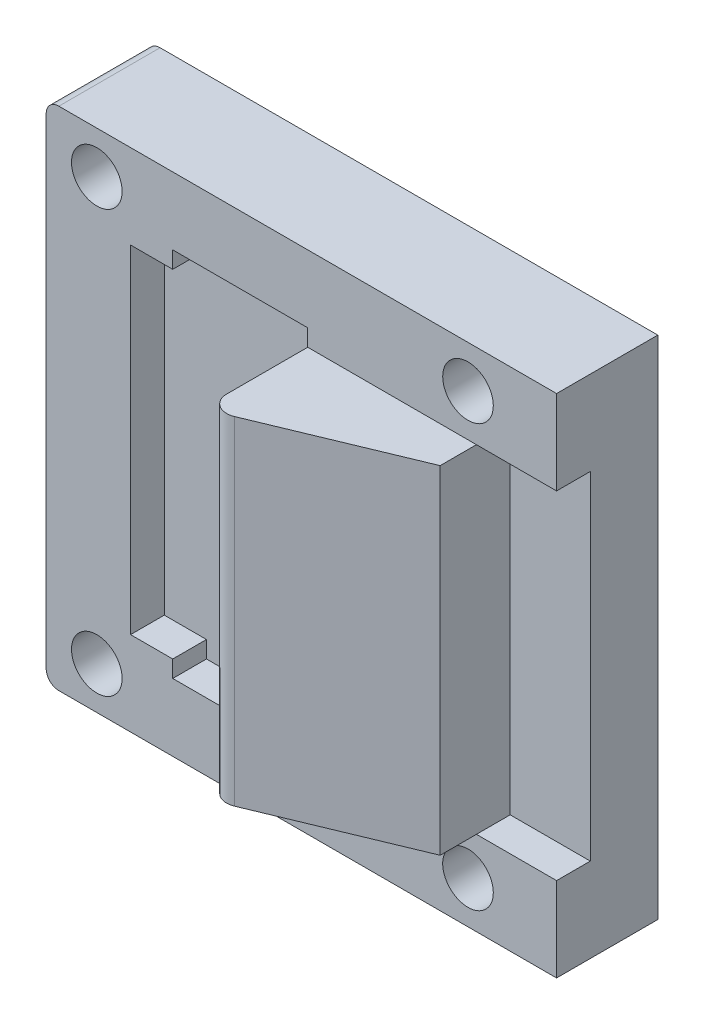
ISO-10303-21;
HEADER;
FILE_DESCRIPTION(('STEP AP214'),'2;1');
FILE_NAME('part.step','',(''),(''),'','','');
FILE_SCHEMA(('AUTOMOTIVE_DESIGN { 1 0 10303 214 1 1 1 1 }'));
ENDSEC;
DATA;
#1=APPLICATION_CONTEXT('core data for automotive mechanical design processes');
#2=APPLICATION_PROTOCOL_DEFINITION('international standard','automotive_design',2000,#1);
#3=PRODUCT_CONTEXT('',#1,'mechanical');
#4=PRODUCT('Part','Part','',(#3));
#5=PRODUCT_RELATED_PRODUCT_CATEGORY('part','',(#4));
#6=PRODUCT_DEFINITION_FORMATION('','',#4);
#7=PRODUCT_DEFINITION_CONTEXT('part definition',#1,'design');
#8=PRODUCT_DEFINITION('design','',#6,#7);
#9=PRODUCT_DEFINITION_SHAPE('','',#8);
#10=(LENGTH_UNIT() NAMED_UNIT(*) SI_UNIT(.MILLI.,.METRE.));
#11=(NAMED_UNIT(*) PLANE_ANGLE_UNIT() SI_UNIT($,.RADIAN.));
#12=(NAMED_UNIT(*) SI_UNIT($,.STERADIAN.) SOLID_ANGLE_UNIT());
#13=UNCERTAINTY_MEASURE_WITH_UNIT(LENGTH_MEASURE(1.E-05),#10,'distance_accuracy_value','');
#14=(GEOMETRIC_REPRESENTATION_CONTEXT(3) GLOBAL_UNCERTAINTY_ASSIGNED_CONTEXT((#13)) GLOBAL_UNIT_ASSIGNED_CONTEXT((#10,
#11,#12)) REPRESENTATION_CONTEXT('',''));
#15=CARTESIAN_POINT('',(0.,0.,0.));
#16=DIRECTION('',(0.,0.,1.));
#17=DIRECTION('',(1.,0.,0.));
#18=AXIS2_PLACEMENT_3D('',#15,#16,#17);
#19=CARTESIAN_POINT('',(-19.25,-14.25,6.));
#20=DIRECTION('',(0.,0.,1.));
#21=DIRECTION('',(0.,-1.,0.));
#22=AXIS2_PLACEMENT_3D('',#19,#20,#21);
#23=CYLINDRICAL_SURFACE('',#22,0.75);
#24=DIRECTION('',(0.,0.,1.));
#25=VECTOR('',#24,1.);
#26=CARTESIAN_POINT('',(-20.,-14.25,6.));
#27=LINE('',#26,#25);
#28=CARTESIAN_POINT('',(-20.,-14.25,0.));
#29=VERTEX_POINT('',#28);
#30=CARTESIAN_POINT('',(-20.,-14.25,6.));
#31=VERTEX_POINT('',#30);
#32=EDGE_CURVE('E266',#29,#31,#27,.T.);
#33=ORIENTED_EDGE('',*,*,#32,.F.);
#34=CARTESIAN_POINT('',(-19.25,-14.25,0.));
#35=DIRECTION('',(0.,0.,1.));
#36=DIRECTION('',(1.,0.,0.));
#37=AXIS2_PLACEMENT_3D('',#34,#35,#36);
#38=CIRCLE('',#37,0.75);
#39=CARTESIAN_POINT('',(-19.25,-15.,0.));
#40=VERTEX_POINT('',#39);
#41=EDGE_CURVE('E272',#40,#29,#38,.F.);
#42=ORIENTED_EDGE('',*,*,#41,.F.);
#43=DIRECTION('',(0.,0.,1.));
#44=VECTOR('',#43,1.);
#45=CARTESIAN_POINT('',(-19.25,-15.,6.));
#46=LINE('',#45,#44);
#47=CARTESIAN_POINT('',(-19.25,-15.,6.));
#48=VERTEX_POINT('',#47);
#49=EDGE_CURVE('E269',#48,#40,#46,.F.);
#50=ORIENTED_EDGE('',*,*,#49,.F.);
#51=CARTESIAN_POINT('',(-19.25,-14.25,6.));
#52=DIRECTION('',(0.,0.,-1.));
#53=DIRECTION('',(0.,1.,0.));
#54=AXIS2_PLACEMENT_3D('',#51,#52,#53);
#55=CIRCLE('',#54,0.75);
#56=EDGE_CURVE('E42',#31,#48,#55,.F.);
#57=ORIENTED_EDGE('',*,*,#56,.F.);
#58=EDGE_LOOP('',(#33,#42,#50,#57));
#59=FACE_BOUND('',#58,.T.);
#60=ADVANCED_FACE('F35',(#59),#23,.T.);
#61=CARTESIAN_POINT('',(-19.25,14.25,6.));
#62=DIRECTION('',(0.,0.,1.));
#63=DIRECTION('',(0.,-1.,0.));
#64=AXIS2_PLACEMENT_3D('',#61,#62,#63);
#65=CYLINDRICAL_SURFACE('',#64,0.75);
#66=DIRECTION('',(0.,0.,1.));
#67=VECTOR('',#66,1.);
#68=CARTESIAN_POINT('',(-19.25,15.,6.));
#69=LINE('',#68,#67);
#70=CARTESIAN_POINT('',(-19.25,15.,0.));
#71=VERTEX_POINT('',#70);
#72=CARTESIAN_POINT('',(-19.25,15.,6.));
#73=VERTEX_POINT('',#72);
#74=EDGE_CURVE('E257',#71,#73,#69,.T.);
#75=ORIENTED_EDGE('',*,*,#74,.F.);
#76=CARTESIAN_POINT('',(-19.25,14.25,0.));
#77=DIRECTION('',(0.,0.,1.));
#78=DIRECTION('',(1.,0.,0.));
#79=AXIS2_PLACEMENT_3D('',#76,#77,#78);
#80=CIRCLE('',#79,0.75);
#81=CARTESIAN_POINT('',(-20.,14.25,0.));
#82=VERTEX_POINT('',#81);
#83=EDGE_CURVE('E228',#82,#71,#80,.F.);
#84=ORIENTED_EDGE('',*,*,#83,.F.);
#85=DIRECTION('',(0.,0.,1.));
#86=VECTOR('',#85,1.);
#87=CARTESIAN_POINT('',(-20.,14.25,6.));
#88=LINE('',#87,#86);
#89=CARTESIAN_POINT('',(-20.,14.25,6.));
#90=VERTEX_POINT('',#89);
#91=EDGE_CURVE('E259',#90,#82,#88,.F.);
#92=ORIENTED_EDGE('',*,*,#91,.F.);
#93=CARTESIAN_POINT('',(-19.25,14.25,6.));
#94=DIRECTION('',(0.,0.,-1.));
#95=DIRECTION('',(0.,1.,0.));
#96=AXIS2_PLACEMENT_3D('',#93,#94,#95);
#97=CIRCLE('',#96,0.75);
#98=EDGE_CURVE('E263',#73,#90,#97,.F.);
#99=ORIENTED_EDGE('',*,*,#98,.F.);
#100=EDGE_LOOP('',(#75,#84,#92,#99));
#101=FACE_BOUND('',#100,.T.);
#102=ADVANCED_FACE('F430',(#101),#65,.T.);
#103=CARTESIAN_POINT('',(-3.5,-20.8269340073725,10.8023065992627));
#104=DIRECTION('',(0.,1.,0.));
#105=DIRECTION('',(0.,0.,1.));
#106=AXIS2_PLACEMENT_3D('',#103,#104,#105);
#107=CYLINDRICAL_SURFACE('',#106,1.);
#108=DIRECTION('',(0.,-1.,0.));
#109=VECTOR('',#108,1.);
#110=CARTESIAN_POINT('',(-3.11669665695071,-20.8269340073725,11.7259291126345));
#111=LINE('',#110,#109);
#112=CARTESIAN_POINT('',(-3.11669665695071,10.,11.7259291126345));
#113=VERTEX_POINT('',#112);
#114=CARTESIAN_POINT('',(-3.11669665695071,-10.,11.7259291126345));
#115=VERTEX_POINT('',#114);
#116=EDGE_CURVE('E243',#113,#115,#111,.T.);
#117=ORIENTED_EDGE('',*,*,#116,.F.);
#118=CARTESIAN_POINT('',(-3.5,10.,10.8023065992627));
#119=DIRECTION('',(0.,-1.,0.));
#120=DIRECTION('',(0.,0.,-1.));
#121=AXIS2_PLACEMENT_3D('',#118,#119,#120);
#122=CIRCLE('',#121,1.);
#123=CARTESIAN_POINT('',(-4.5,10.,10.8023065992627));
#124=VERTEX_POINT('',#123);
#125=EDGE_CURVE('E253',#124,#113,#122,.F.);
#126=ORIENTED_EDGE('',*,*,#125,.F.);
#127=DIRECTION('',(0.,-1.,0.));
#128=VECTOR('',#127,1.);
#129=CARTESIAN_POINT('',(-4.5,-20.8269340073725,10.8023065992627));
#130=LINE('',#129,#128);
#131=CARTESIAN_POINT('',(-4.5,-10.,10.8023065992627));
#132=VERTEX_POINT('',#131);
#133=EDGE_CURVE('E250',#132,#124,#130,.F.);
#134=ORIENTED_EDGE('',*,*,#133,.F.);
#135=CARTESIAN_POINT('',(-3.5,-10.,10.8023065992627));
#136=DIRECTION('',(0.,1.,0.));
#137=DIRECTION('',(-1.,0.,0.));
#138=AXIS2_PLACEMENT_3D('',#135,#136,#137);
#139=CIRCLE('',#138,1.);
#140=EDGE_CURVE('E255',#115,#132,#139,.F.);
#141=ORIENTED_EDGE('',*,*,#140,.F.);
#142=EDGE_LOOP('',(#117,#126,#134,#141));
#143=FACE_BOUND('',#142,.T.);
#144=ADVANCED_FACE('F463',(#143),#107,.T.);
#145=CARTESIAN_POINT('',(15.,-10.,6.));
#146=DIRECTION('',(0.,1.,0.));
#147=DIRECTION('',(-1.,0.,0.));
#148=AXIS2_PLACEMENT_3D('',#145,#146,#147);
#149=PLANE('',#148);
#150=DIRECTION('',(0.,0.,1.));
#151=VECTOR('',#150,1.);
#152=CARTESIAN_POINT('',(-12.5,-10.,6.));
#153=LINE('',#152,#151);
#154=CARTESIAN_POINT('',(-12.5,-10.,4.));
#155=VERTEX_POINT('',#154);
#156=CARTESIAN_POINT('',(-12.5,-10.,6.));
#157=VERTEX_POINT('',#156);
#158=EDGE_CURVE('E347',#155,#157,#153,.T.);
#159=ORIENTED_EDGE('',*,*,#158,.F.);
#160=DIRECTION('',(1.,0.,0.));
#161=VECTOR('',#160,1.);
#162=CARTESIAN_POINT('',(-15.,-10.,4.));
#163=LINE('',#162,#161);
#164=CARTESIAN_POINT('',(-15.,-10.,4.));
#165=VERTEX_POINT('',#164);
#166=EDGE_CURVE('E389',#165,#155,#163,.T.);
#167=ORIENTED_EDGE('',*,*,#166,.F.);
#168=DIRECTION('',(0.,0.,-1.));
#169=VECTOR('',#168,1.);
#170=CARTESIAN_POINT('',(-15.,-10.,6.));
#171=LINE('',#170,#169);
#172=CARTESIAN_POINT('',(-15.,-10.,6.));
#173=VERTEX_POINT('',#172);
#174=EDGE_CURVE('E240',#173,#165,#171,.T.);
#175=ORIENTED_EDGE('',*,*,#174,.F.);
#176=DIRECTION('',(1.,0.,0.));
#177=VECTOR('',#176,1.);
#178=CARTESIAN_POINT('',(15.,-10.,6.));
#179=LINE('',#178,#177);
#180=EDGE_CURVE('E247',#173,#157,#179,.T.);
#181=ORIENTED_EDGE('',*,*,#180,.T.);
#182=EDGE_LOOP('',(#159,#167,#175,#181));
#183=FACE_BOUND('',#182,.T.);
#184=ADVANCED_FACE('F482',(#183),#149,.T.);
#185=DIRECTION('',(0.,0.,1.));
#186=VECTOR('',#185,1.);
#187=CARTESIAN_POINT('',(10.25,-10.,6.));
#188=LINE('',#187,#186);
#189=CARTESIAN_POINT('',(10.25,-10.,4.));
#190=VERTEX_POINT('',#189);
#191=CARTESIAN_POINT('',(10.25,-10.,6.));
#192=VERTEX_POINT('',#191);
#193=EDGE_CURVE('E435',#190,#192,#188,.T.);
#194=ORIENTED_EDGE('',*,*,#193,.F.);
#195=DIRECTION('',(1.,0.,0.));
#196=VECTOR('',#195,1.);
#197=CARTESIAN_POINT('',(5.5,-10.,4.));
#198=LINE('',#197,#196);
#199=CARTESIAN_POINT('',(5.5,-10.,4.));
#200=VERTEX_POINT('',#199);
#201=EDGE_CURVE('E379',#200,#190,#198,.T.);
#202=ORIENTED_EDGE('',*,*,#201,.F.);
#203=DIRECTION('',(0.,0.,-1.));
#204=VECTOR('',#203,1.);
#205=CARTESIAN_POINT('',(5.5,-10.,32.6606797749979));
#206=LINE('',#205,#204);
#207=CARTESIAN_POINT('',(5.5,-10.,6.));
#208=VERTEX_POINT('',#207);
#209=EDGE_CURVE('E388',#208,#200,#206,.T.);
#210=ORIENTED_EDGE('',*,*,#209,.F.);
#211=EDGE_CURVE('E420',#208,#192,#179,.T.);
#212=ORIENTED_EDGE('',*,*,#211,.T.);
#213=EDGE_LOOP('',(#194,#202,#210,#212));
#214=FACE_BOUND('',#213,.T.);
#215=ADVANCED_FACE('F444',(#214),#149,.T.);
#216=CARTESIAN_POINT('',(15.,10.,6.));
#217=DIRECTION('',(0.,-1.,0.));
#218=DIRECTION('',(1.,0.,0.));
#219=AXIS2_PLACEMENT_3D('',#216,#217,#218);
#220=PLANE('',#219);
#221=DIRECTION('',(0.,0.,-1.));
#222=VECTOR('',#221,1.);
#223=CARTESIAN_POINT('',(-12.5,9.99999999999999,6.));
#224=LINE('',#223,#222);
#225=CARTESIAN_POINT('',(-12.5,9.99999999999999,6.));
#226=VERTEX_POINT('',#225);
#227=CARTESIAN_POINT('',(-12.5,10.,4.));
#228=VERTEX_POINT('',#227);
#229=EDGE_CURVE('E345',#226,#228,#224,.T.);
#230=ORIENTED_EDGE('',*,*,#229,.F.);
#231=DIRECTION('',(-1.,0.,0.));
#232=VECTOR('',#231,1.);
#233=CARTESIAN_POINT('',(15.,10.,6.));
#234=LINE('',#233,#232);
#235=CARTESIAN_POINT('',(-15.,9.99999999999999,6.));
#236=VERTEX_POINT('',#235);
#237=EDGE_CURVE('E413',#226,#236,#234,.T.);
#238=ORIENTED_EDGE('',*,*,#237,.T.);
#239=DIRECTION('',(0.,0.,-1.));
#240=VECTOR('',#239,1.);
#241=CARTESIAN_POINT('',(-15.,9.99999999999999,6.));
#242=LINE('',#241,#240);
#243=CARTESIAN_POINT('',(-15.,10.,4.));
#244=VERTEX_POINT('',#243);
#245=EDGE_CURVE('E244',#236,#244,#242,.T.);
#246=ORIENTED_EDGE('',*,*,#245,.T.);
#247=DIRECTION('',(-1.,0.,0.));
#248=VECTOR('',#247,1.);
#249=CARTESIAN_POINT('',(-15.,10.,4.));
#250=LINE('',#249,#248);
#251=EDGE_CURVE('E382',#228,#244,#250,.T.);
#252=ORIENTED_EDGE('',*,*,#251,.F.);
#253=EDGE_LOOP('',(#230,#238,#246,#252));
#254=FACE_BOUND('',#253,.T.);
#255=ADVANCED_FACE('F494',(#254),#220,.T.);
#256=DIRECTION('',(0.,0.,-1.));
#257=VECTOR('',#256,1.);
#258=CARTESIAN_POINT('',(10.25,10.,6.));
#259=LINE('',#258,#257);
#260=CARTESIAN_POINT('',(10.25,10.,6.));
#261=VERTEX_POINT('',#260);
#262=CARTESIAN_POINT('',(10.25,10.,4.));
#263=VERTEX_POINT('',#262);
#264=EDGE_CURVE('E48',#261,#263,#259,.T.);
#265=ORIENTED_EDGE('',*,*,#264,.F.);
#266=CARTESIAN_POINT('',(5.5,10.,6.));
#267=VERTEX_POINT('',#266);
#268=EDGE_CURVE('E414',#261,#267,#234,.T.);
#269=ORIENTED_EDGE('',*,*,#268,.T.);
#270=DIRECTION('',(0.,0.,-1.));
#271=VECTOR('',#270,1.);
#272=CARTESIAN_POINT('',(5.5,10.,32.6606797749979));
#273=LINE('',#272,#271);
#274=CARTESIAN_POINT('',(5.5,10.,4.));
#275=VERTEX_POINT('',#274);
#276=EDGE_CURVE('E408',#267,#275,#273,.T.);
#277=ORIENTED_EDGE('',*,*,#276,.T.);
#278=DIRECTION('',(-1.,0.,0.));
#279=VECTOR('',#278,1.);
#280=CARTESIAN_POINT('',(5.5,10.,4.));
#281=LINE('',#280,#279);
#282=EDGE_CURVE('E377',#263,#275,#281,.T.);
#283=ORIENTED_EDGE('',*,*,#282,.F.);
#284=EDGE_LOOP('',(#265,#269,#277,#283));
#285=FACE_BOUND('',#284,.T.);
#286=ADVANCED_FACE('F504',(#285),#220,.T.);
#287=CARTESIAN_POINT('',(0.,0.,0.));
#288=DIRECTION('',(0.,0.,1.));
#289=DIRECTION('',(1.,0.,0.));
#290=AXIS2_PLACEMENT_3D('',#287,#288,#289);
#291=PLANE('',#290);
#292=CARTESIAN_POINT('',(-17.,12.5,0.));
#293=DIRECTION('',(0.,0.,1.));
#294=DIRECTION('',(1.,0.,0.));
#295=AXIS2_PLACEMENT_3D('',#292,#293,#294);
#296=CIRCLE('',#295,1.5);
#297=CARTESIAN_POINT('',(-15.5,12.5,0.));
#298=VERTEX_POINT('',#297);
#299=EDGE_CURVE('E352',#298,#298,#296,.F.);
#300=ORIENTED_EDGE('',*,*,#299,.F.);
#301=EDGE_LOOP('',(#300));
#302=FACE_BOUND('',#301,.T.);
#303=CARTESIAN_POINT('',(5.,12.5,0.));
#304=DIRECTION('',(0.,0.,1.));
#305=DIRECTION('',(1.,0.,0.));
#306=AXIS2_PLACEMENT_3D('',#303,#304,#305);
#307=CIRCLE('',#306,1.5);
#308=CARTESIAN_POINT('',(6.5,12.5,0.));
#309=VERTEX_POINT('',#308);
#310=EDGE_CURVE('E358',#309,#309,#307,.F.);
#311=ORIENTED_EDGE('',*,*,#310,.F.);
#312=EDGE_LOOP('',(#311));
#313=FACE_BOUND('',#312,.T.);
#314=CARTESIAN_POINT('',(5.,-12.5,0.));
#315=DIRECTION('',(0.,0.,1.));
#316=DIRECTION('',(1.,0.,0.));
#317=AXIS2_PLACEMENT_3D('',#314,#315,#316);
#318=CIRCLE('',#317,1.5);
#319=CARTESIAN_POINT('',(6.5,-12.5,0.));
#320=VERTEX_POINT('',#319);
#321=EDGE_CURVE('E364',#320,#320,#318,.F.);
#322=ORIENTED_EDGE('',*,*,#321,.F.);
#323=EDGE_LOOP('',(#322));
#324=FACE_BOUND('',#323,.T.);
#325=CARTESIAN_POINT('',(-17.,-12.5,0.));
#326=DIRECTION('',(0.,0.,1.));
#327=DIRECTION('',(1.,0.,0.));
#328=AXIS2_PLACEMENT_3D('',#325,#326,#327);
#329=CIRCLE('',#328,1.5);
#330=CARTESIAN_POINT('',(-15.5,-12.5,0.));
#331=VERTEX_POINT('',#330);
#332=EDGE_CURVE('E370',#331,#331,#329,.F.);
#333=ORIENTED_EDGE('',*,*,#332,.F.);
#334=EDGE_LOOP('',(#333));
#335=FACE_BOUND('',#334,.T.);
#336=DIRECTION('',(1.,0.,0.));
#337=VECTOR('',#336,1.);
#338=CARTESIAN_POINT('',(15.,15.,0.));
#339=LINE('',#338,#337);
#340=CARTESIAN_POINT('',(10.25,15.,0.));
#341=VERTEX_POINT('',#340);
#342=EDGE_CURVE('E221',#71,#341,#339,.T.);
#343=ORIENTED_EDGE('',*,*,#342,.T.);
#344=DIRECTION('',(0.,-1.,0.));
#345=VECTOR('',#344,1.);
#346=CARTESIAN_POINT('',(10.25,17.7975936846337,0.));
#347=LINE('',#346,#345);
#348=CARTESIAN_POINT('',(10.25,-15.,0.));
#349=VERTEX_POINT('',#348);
#350=EDGE_CURVE('E205',#341,#349,#347,.T.);
#351=ORIENTED_EDGE('',*,*,#350,.T.);
#352=DIRECTION('',(-1.,0.,0.));
#353=VECTOR('',#352,1.);
#354=CARTESIAN_POINT('',(15.,-15.,0.));
#355=LINE('',#354,#353);
#356=EDGE_CURVE('E285',#349,#40,#355,.T.);
#357=ORIENTED_EDGE('',*,*,#356,.T.);
#358=ORIENTED_EDGE('',*,*,#41,.T.);
#359=DIRECTION('',(0.,1.,0.));
#360=VECTOR('',#359,1.);
#361=CARTESIAN_POINT('',(-20.,15.,0.));
#362=LINE('',#361,#360);
#363=CARTESIAN_POINT('',(-20.,-2.5,0.));
#364=VERTEX_POINT('',#363);
#365=EDGE_CURVE('E231',#29,#364,#362,.T.);
#366=ORIENTED_EDGE('',*,*,#365,.T.);
#367=DIRECTION('',(-1.,0.,0.));
#368=VECTOR('',#367,1.);
#369=CARTESIAN_POINT('',(7.49999999999999,-2.5,0.));
#370=LINE('',#369,#368);
#371=CARTESIAN_POINT('',(7.49999999999999,-2.5,0.));
#372=VERTEX_POINT('',#371);
#373=EDGE_CURVE('E304',#372,#364,#370,.T.);
#374=ORIENTED_EDGE('',*,*,#373,.F.);
#375=DIRECTION('',(0.,-1.,0.));
#376=VECTOR('',#375,1.);
#377=CARTESIAN_POINT('',(7.49999999999999,-2.5,0.));
#378=LINE('',#377,#376);
#379=CARTESIAN_POINT('',(7.5,2.5,0.));
#380=VERTEX_POINT('',#379);
#381=EDGE_CURVE('E224',#380,#372,#378,.T.);
#382=ORIENTED_EDGE('',*,*,#381,.F.);
#383=DIRECTION('',(1.,0.,0.));
#384=VECTOR('',#383,1.);
#385=CARTESIAN_POINT('',(7.5,2.5,0.));
#386=LINE('',#385,#384);
#387=CARTESIAN_POINT('',(-20.,2.5,0.));
#388=VERTEX_POINT('',#387);
#389=EDGE_CURVE('E294',#388,#380,#386,.T.);
#390=ORIENTED_EDGE('',*,*,#389,.F.);
#391=EDGE_CURVE('E236',#388,#82,#362,.T.);
#392=ORIENTED_EDGE('',*,*,#391,.T.);
#393=ORIENTED_EDGE('',*,*,#83,.T.);
#394=EDGE_LOOP('',(#343,#351,#357,#358,#366,#374,#382,#390,#392,#393));
#395=FACE_BOUND('',#394,.T.);
#396=ADVANCED_FACE('F226',(#302,#313,#324,#335,#395),#291,.F.);
#397=CARTESIAN_POINT('',(-15.,9.99999999999999,6.));
#398=DIRECTION('',(1.,0.,0.));
#399=DIRECTION('',(0.,0.,-1.));
#400=AXIS2_PLACEMENT_3D('',#397,#398,#399);
#401=PLANE('',#400);
#402=DIRECTION('',(0.,-1.,0.));
#403=VECTOR('',#402,1.);
#404=CARTESIAN_POINT('',(-15.,-10.,4.));
#405=LINE('',#404,#403);
#406=EDGE_CURVE('E392',#244,#165,#405,.T.);
#407=ORIENTED_EDGE('',*,*,#406,.F.);
#408=ORIENTED_EDGE('',*,*,#245,.F.);
#409=DIRECTION('',(0.,-1.,0.));
#410=VECTOR('',#409,1.);
#411=CARTESIAN_POINT('',(-15.,9.99999999999999,6.));
#412=LINE('',#411,#410);
#413=EDGE_CURVE('E416',#236,#173,#412,.T.);
#414=ORIENTED_EDGE('',*,*,#413,.T.);
#415=ORIENTED_EDGE('',*,*,#174,.T.);
#416=EDGE_LOOP('',(#407,#408,#414,#415));
#417=FACE_BOUND('',#416,.T.);
#418=ADVANCED_FACE('F490',(#417),#401,.T.);
#419=CARTESIAN_POINT('',(15.,15.,6.));
#420=DIRECTION('',(0.,1.,0.));
#421=DIRECTION('',(-1.,0.,0.));
#422=AXIS2_PLACEMENT_3D('',#419,#420,#421);
#423=PLANE('',#422);
#424=DIRECTION('',(0.,0.,1.));
#425=VECTOR('',#424,1.);
#426=CARTESIAN_POINT('',(10.25,15.,6.));
#427=LINE('',#426,#425);
#428=CARTESIAN_POINT('',(10.25,15.,6.));
#429=VERTEX_POINT('',#428);
#430=EDGE_CURVE('E208',#341,#429,#427,.T.);
#431=ORIENTED_EDGE('',*,*,#430,.F.);
#432=ORIENTED_EDGE('',*,*,#342,.F.);
#433=ORIENTED_EDGE('',*,*,#74,.T.);
#434=DIRECTION('',(1.,0.,0.));
#435=VECTOR('',#434,1.);
#436=CARTESIAN_POINT('',(15.,15.,6.));
#437=LINE('',#436,#435);
#438=EDGE_CURVE('E223',#73,#429,#437,.T.);
#439=ORIENTED_EDGE('',*,*,#438,.T.);
#440=EDGE_LOOP('',(#431,#432,#433,#439));
#441=FACE_BOUND('',#440,.T.);
#442=ADVANCED_FACE('F219',(#441),#423,.T.);
#443=CARTESIAN_POINT('',(-20.,15.,6.));
#444=DIRECTION('',(-1.,0.,0.));
#445=DIRECTION('',(0.,0.,1.));
#446=AXIS2_PLACEMENT_3D('',#443,#444,#445);
#447=PLANE('',#446);
#448=DIRECTION('',(0.,0.,-1.));
#449=VECTOR('',#448,1.);
#450=CARTESIAN_POINT('',(-20.,2.5,2.));
#451=LINE('',#450,#449);
#452=CARTESIAN_POINT('',(-20.,2.5,2.));
#453=VERTEX_POINT('',#452);
#454=EDGE_CURVE('E311',#453,#388,#451,.T.);
#455=ORIENTED_EDGE('',*,*,#454,.F.);
#456=DIRECTION('',(0.,1.,0.));
#457=VECTOR('',#456,1.);
#458=CARTESIAN_POINT('',(-20.,-2.5,2.));
#459=LINE('',#458,#457);
#460=CARTESIAN_POINT('',(-20.,-2.5,2.));
#461=VERTEX_POINT('',#460);
#462=EDGE_CURVE('E296',#461,#453,#459,.T.);
#463=ORIENTED_EDGE('',*,*,#462,.F.);
#464=DIRECTION('',(0.,0.,-1.));
#465=VECTOR('',#464,1.);
#466=CARTESIAN_POINT('',(-20.,-2.5,2.));
#467=LINE('',#466,#465);
#468=EDGE_CURVE('E313',#461,#364,#467,.T.);
#469=ORIENTED_EDGE('',*,*,#468,.T.);
#470=ORIENTED_EDGE('',*,*,#365,.F.);
#471=ORIENTED_EDGE('',*,*,#32,.T.);
#472=DIRECTION('',(0.,1.,0.));
#473=VECTOR('',#472,1.);
#474=CARTESIAN_POINT('',(-20.,15.,6.));
#475=LINE('',#474,#473);
#476=EDGE_CURVE('E233',#31,#90,#475,.T.);
#477=ORIENTED_EDGE('',*,*,#476,.T.);
#478=ORIENTED_EDGE('',*,*,#91,.T.);
#479=ORIENTED_EDGE('',*,*,#391,.F.);
#480=EDGE_LOOP('',(#455,#463,#469,#470,#471,#477,#478,#479));
#481=FACE_BOUND('',#480,.T.);
#482=ADVANCED_FACE('F431',(#481),#447,.T.);
#483=CARTESIAN_POINT('',(15.,-15.,6.));
#484=DIRECTION('',(0.,-1.,0.));
#485=DIRECTION('',(1.,0.,0.));
#486=AXIS2_PLACEMENT_3D('',#483,#484,#485);
#487=PLANE('',#486);
#488=DIRECTION('',(0.,0.,-1.));
#489=VECTOR('',#488,1.);
#490=CARTESIAN_POINT('',(10.25,-15.,6.));
#491=LINE('',#490,#489);
#492=CARTESIAN_POINT('',(10.25,-15.,6.));
#493=VERTEX_POINT('',#492);
#494=EDGE_CURVE('E211',#493,#349,#491,.T.);
#495=ORIENTED_EDGE('',*,*,#494,.F.);
#496=DIRECTION('',(-1.,0.,0.));
#497=VECTOR('',#496,1.);
#498=CARTESIAN_POINT('',(15.,-15.,6.));
#499=LINE('',#498,#497);
#500=EDGE_CURVE('E230',#493,#48,#499,.T.);
#501=ORIENTED_EDGE('',*,*,#500,.T.);
#502=ORIENTED_EDGE('',*,*,#49,.T.);
#503=ORIENTED_EDGE('',*,*,#356,.F.);
#504=EDGE_LOOP('',(#495,#501,#502,#503));
#505=FACE_BOUND('',#504,.T.);
#506=ADVANCED_FACE('F284',(#505),#487,.T.);
#507=CARTESIAN_POINT('',(0.,0.,6.));
#508=DIRECTION('',(0.,0.,-1.));
#509=DIRECTION('',(0.,1.,0.));
#510=AXIS2_PLACEMENT_3D('',#507,#508,#509);
#511=PLANE('',#510);
#512=CARTESIAN_POINT('',(-17.,12.5,6.));
#513=DIRECTION('',(0.,0.,1.));
#514=DIRECTION('',(-1.,0.,0.));
#515=AXIS2_PLACEMENT_3D('',#512,#513,#514);
#516=CIRCLE('',#515,1.5);
#517=CARTESIAN_POINT('',(-18.5,12.5,6.));
#518=VERTEX_POINT('',#517);
#519=EDGE_CURVE('E349',#518,#518,#516,.T.);
#520=ORIENTED_EDGE('',*,*,#519,.F.);
#521=EDGE_LOOP('',(#520));
#522=FACE_BOUND('',#521,.T.);
#523=CARTESIAN_POINT('',(5.,12.5,6.));
#524=DIRECTION('',(0.,0.,1.));
#525=DIRECTION('',(-1.,0.,0.));
#526=AXIS2_PLACEMENT_3D('',#523,#524,#525);
#527=CIRCLE('',#526,1.5);
#528=CARTESIAN_POINT('',(3.5,12.5,6.));
#529=VERTEX_POINT('',#528);
#530=EDGE_CURVE('E355',#529,#529,#527,.T.);
#531=ORIENTED_EDGE('',*,*,#530,.F.);
#532=EDGE_LOOP('',(#531));
#533=FACE_BOUND('',#532,.T.);
#534=CARTESIAN_POINT('',(5.,-12.5,6.));
#535=DIRECTION('',(0.,0.,1.));
#536=DIRECTION('',(1.,0.,0.));
#537=AXIS2_PLACEMENT_3D('',#534,#535,#536);
#538=CIRCLE('',#537,1.5);
#539=CARTESIAN_POINT('',(6.5,-12.5,6.));
#540=VERTEX_POINT('',#539);
#541=EDGE_CURVE('E361',#540,#540,#538,.T.);
#542=ORIENTED_EDGE('',*,*,#541,.F.);
#543=EDGE_LOOP('',(#542));
#544=FACE_BOUND('',#543,.T.);
#545=CARTESIAN_POINT('',(-17.,-12.5,6.));
#546=DIRECTION('',(0.,0.,1.));
#547=DIRECTION('',(1.,0.,0.));
#548=AXIS2_PLACEMENT_3D('',#545,#546,#547);
#549=CIRCLE('',#548,1.5);
#550=CARTESIAN_POINT('',(-15.5,-12.5,6.));
#551=VERTEX_POINT('',#550);
#552=EDGE_CURVE('E367',#551,#551,#549,.T.);
#553=ORIENTED_EDGE('',*,*,#552,.F.);
#554=EDGE_LOOP('',(#553));
#555=FACE_BOUND('',#554,.T.);
#556=ORIENTED_EDGE('',*,*,#500,.F.);
#557=DIRECTION('',(0.,1.,0.));
#558=VECTOR('',#557,1.);
#559=CARTESIAN_POINT('',(10.25,0.,6.));
#560=LINE('',#559,#558);
#561=EDGE_CURVE('E286',#493,#192,#560,.T.);
#562=ORIENTED_EDGE('',*,*,#561,.T.);
#563=ORIENTED_EDGE('',*,*,#211,.F.);
#564=CARTESIAN_POINT('',(-4.5,-10.,6.));
#565=VERTEX_POINT('',#564);
#566=EDGE_CURVE('E422',#565,#208,#179,.T.);
#567=ORIENTED_EDGE('',*,*,#566,.F.);
#568=DIRECTION('',(0.,1.,0.));
#569=VECTOR('',#568,1.);
#570=CARTESIAN_POINT('',(-4.5,11.,6.));
#571=LINE('',#570,#569);
#572=CARTESIAN_POINT('',(-4.5,-11.,6.));
#573=VERTEX_POINT('',#572);
#574=EDGE_CURVE('E331',#573,#565,#571,.T.);
#575=ORIENTED_EDGE('',*,*,#574,.F.);
#576=DIRECTION('',(1.,0.,0.));
#577=VECTOR('',#576,1.);
#578=CARTESIAN_POINT('',(-12.5,-11.,6.));
#579=LINE('',#578,#577);
#580=CARTESIAN_POINT('',(-12.5,-11.,6.));
#581=VERTEX_POINT('',#580);
#582=EDGE_CURVE('E327',#581,#573,#579,.T.);
#583=ORIENTED_EDGE('',*,*,#582,.F.);
#584=DIRECTION('',(0.,-1.,0.));
#585=VECTOR('',#584,1.);
#586=CARTESIAN_POINT('',(-12.5,11.,6.));
#587=LINE('',#586,#585);
#588=EDGE_CURVE('E310',#157,#581,#587,.T.);
#589=ORIENTED_EDGE('',*,*,#588,.F.);
#590=ORIENTED_EDGE('',*,*,#180,.F.);
#591=ORIENTED_EDGE('',*,*,#413,.F.);
#592=ORIENTED_EDGE('',*,*,#237,.F.);
#593=CARTESIAN_POINT('',(-12.5,11.,6.));
#594=VERTEX_POINT('',#593);
#595=EDGE_CURVE('E325',#594,#226,#587,.T.);
#596=ORIENTED_EDGE('',*,*,#595,.F.);
#597=DIRECTION('',(-1.,0.,0.));
#598=VECTOR('',#597,1.);
#599=CARTESIAN_POINT('',(-12.5,11.,6.));
#600=LINE('',#599,#598);
#601=CARTESIAN_POINT('',(-4.5,11.,6.));
#602=VERTEX_POINT('',#601);
#603=EDGE_CURVE('E333',#602,#594,#600,.T.);
#604=ORIENTED_EDGE('',*,*,#603,.F.);
#605=CARTESIAN_POINT('',(-4.5,10.,6.));
#606=VERTEX_POINT('',#605);
#607=EDGE_CURVE('E330',#606,#602,#571,.T.);
#608=ORIENTED_EDGE('',*,*,#607,.F.);
#609=EDGE_CURVE('E417',#267,#606,#234,.T.);
#610=ORIENTED_EDGE('',*,*,#609,.F.);
#611=ORIENTED_EDGE('',*,*,#268,.F.);
#612=EDGE_CURVE('E288',#261,#429,#560,.T.);
#613=ORIENTED_EDGE('',*,*,#612,.T.);
#614=ORIENTED_EDGE('',*,*,#438,.F.);
#615=ORIENTED_EDGE('',*,*,#98,.T.);
#616=ORIENTED_EDGE('',*,*,#476,.F.);
#617=ORIENTED_EDGE('',*,*,#56,.T.);
#618=EDGE_LOOP('',(#556,#562,#563,#567,#575,#583,#589,#590,#591,#592,#596,#604,#608,#610,#611,
#613,#614,#615,#616,#617));
#619=FACE_BOUND('',#618,.T.);
#620=ADVANCED_FACE('F278',(#522,#533,#544,#555,#619),#511,.F.);
#621=CARTESIAN_POINT('',(5.5,-10.,32.6606797749979));
#622=DIRECTION('',(0.,1.,0.));
#623=DIRECTION('',(-1.,0.,0.));
#624=AXIS2_PLACEMENT_3D('',#621,#622,#623);
#625=PLANE('',#624);
#626=DIRECTION('',(-0.923622513371796,0.,0.383303343049295));
#627=VECTOR('',#626,1.);
#628=CARTESIAN_POINT('',(-4.5,-10.,12.3));
#629=LINE('',#628,#627);
#630=CARTESIAN_POINT('',(5.5,-10.,8.15));
#631=VERTEX_POINT('',#630);
#632=EDGE_CURVE('E374',#631,#115,#629,.T.);
#633=ORIENTED_EDGE('',*,*,#632,.T.);
#634=ORIENTED_EDGE('',*,*,#140,.T.);
#635=DIRECTION('',(0.,0.,-1.));
#636=VECTOR('',#635,1.);
#637=CARTESIAN_POINT('',(-4.5,-10.,32.6606797749979));
#638=LINE('',#637,#636);
#639=EDGE_CURVE('E402',#132,#565,#638,.T.);
#640=ORIENTED_EDGE('',*,*,#639,.T.);
#641=ORIENTED_EDGE('',*,*,#566,.T.);
#642=EDGE_CURVE('E399',#631,#208,#206,.T.);
#643=ORIENTED_EDGE('',*,*,#642,.F.);
#644=EDGE_LOOP('',(#633,#634,#640,#641,#643));
#645=FACE_BOUND('',#644,.T.);
#646=ADVANCED_FACE('F448',(#645),#625,.F.);
#647=CARTESIAN_POINT('',(5.5,10.,32.6606797749979));
#648=DIRECTION('',(0.,-1.,0.));
#649=DIRECTION('',(0.,0.,-1.));
#650=AXIS2_PLACEMENT_3D('',#647,#648,#649);
#651=PLANE('',#650);
#652=DIRECTION('',(0.,0.,-1.));
#653=VECTOR('',#652,1.);
#654=CARTESIAN_POINT('',(-4.5,10.,32.6606797749979));
#655=LINE('',#654,#653);
#656=EDGE_CURVE('E405',#124,#606,#655,.T.);
#657=ORIENTED_EDGE('',*,*,#656,.F.);
#658=ORIENTED_EDGE('',*,*,#125,.T.);
#659=DIRECTION('',(0.923622513371796,0.,-0.383303343049295));
#660=VECTOR('',#659,1.);
#661=CARTESIAN_POINT('',(-4.5,10.,12.3));
#662=LINE('',#661,#660);
#663=CARTESIAN_POINT('',(5.5,10.,8.15));
#664=VERTEX_POINT('',#663);
#665=EDGE_CURVE('E373',#113,#664,#662,.T.);
#666=ORIENTED_EDGE('',*,*,#665,.T.);
#667=EDGE_CURVE('E398',#664,#267,#273,.T.);
#668=ORIENTED_EDGE('',*,*,#667,.T.);
#669=ORIENTED_EDGE('',*,*,#609,.T.);
#670=EDGE_LOOP('',(#657,#658,#666,#668,#669));
#671=FACE_BOUND('',#670,.T.);
#672=ADVANCED_FACE('F499',(#671),#651,.F.);
#673=CARTESIAN_POINT('',(-4.5,-10.,32.6606797749979));
#674=DIRECTION('',(1.,0.,0.));
#675=DIRECTION('',(0.,0.,-1.));
#676=AXIS2_PLACEMENT_3D('',#673,#674,#675);
#677=PLANE('',#676);
#678=ORIENTED_EDGE('',*,*,#656,.T.);
#679=ORIENTED_EDGE('',*,*,#607,.T.);
#680=DIRECTION('',(0.,0.,1.));
#681=VECTOR('',#680,1.);
#682=CARTESIAN_POINT('',(-4.5,11.,-19.4093998214393));
#683=LINE('',#682,#681);
#684=CARTESIAN_POINT('',(-4.5,11.,4.));
#685=VERTEX_POINT('',#684);
#686=EDGE_CURVE('E338',#685,#602,#683,.T.);
#687=ORIENTED_EDGE('',*,*,#686,.F.);
#688=DIRECTION('',(0.,1.,0.));
#689=VECTOR('',#688,1.);
#690=CARTESIAN_POINT('',(-4.5,-10.,4.));
#691=LINE('',#690,#689);
#692=CARTESIAN_POINT('',(-4.5,-11.,3.99999999999999));
#693=VERTEX_POINT('',#692);
#694=EDGE_CURVE('E386',#693,#685,#691,.T.);
#695=ORIENTED_EDGE('',*,*,#694,.F.);
#696=DIRECTION('',(0.,0.,1.));
#697=VECTOR('',#696,1.);
#698=CARTESIAN_POINT('',(-4.5,-11.,-19.4093998214393));
#699=LINE('',#698,#697);
#700=EDGE_CURVE('E341',#693,#573,#699,.T.);
#701=ORIENTED_EDGE('',*,*,#700,.T.);
#702=ORIENTED_EDGE('',*,*,#574,.T.);
#703=ORIENTED_EDGE('',*,*,#639,.F.);
#704=ORIENTED_EDGE('',*,*,#133,.T.);
#705=EDGE_LOOP('',(#678,#679,#687,#695,#701,#702,#703,#704));
#706=FACE_BOUND('',#705,.T.);
#707=ADVANCED_FACE('F466',(#706),#677,.F.);
#708=CARTESIAN_POINT('',(5.5,-10.,32.6606797749979));
#709=DIRECTION('',(-1.,0.,0.));
#710=DIRECTION('',(0.,0.,1.));
#711=AXIS2_PLACEMENT_3D('',#708,#709,#710);
#712=PLANE('',#711);
#713=ORIENTED_EDGE('',*,*,#209,.T.);
#714=DIRECTION('',(0.,-1.,0.));
#715=VECTOR('',#714,1.);
#716=CARTESIAN_POINT('',(5.5,10.,4.));
#717=LINE('',#716,#715);
#718=EDGE_CURVE('E383',#275,#200,#717,.T.);
#719=ORIENTED_EDGE('',*,*,#718,.F.);
#720=ORIENTED_EDGE('',*,*,#276,.F.);
#721=ORIENTED_EDGE('',*,*,#667,.F.);
#722=DIRECTION('',(0.,-1.,0.));
#723=VECTOR('',#722,1.);
#724=CARTESIAN_POINT('',(5.5,-10.,8.15));
#725=LINE('',#724,#723);
#726=EDGE_CURVE('E395',#664,#631,#725,.T.);
#727=ORIENTED_EDGE('',*,*,#726,.T.);
#728=ORIENTED_EDGE('',*,*,#642,.T.);
#729=EDGE_LOOP('',(#713,#719,#720,#721,#727,#728));
#730=FACE_BOUND('',#729,.T.);
#731=ADVANCED_FACE('F452',(#730),#712,.F.);
#732=CARTESIAN_POINT('',(0.,0.,4.));
#733=DIRECTION('',(0.,0.,1.));
#734=DIRECTION('',(1.,0.,0.));
#735=AXIS2_PLACEMENT_3D('',#732,#733,#734);
#736=PLANE('',#735);
#737=ORIENTED_EDGE('',*,*,#166,.T.);
#738=DIRECTION('',(0.,1.,0.));
#739=VECTOR('',#738,1.);
#740=CARTESIAN_POINT('',(-12.5,11.,4.));
#741=LINE('',#740,#739);
#742=CARTESIAN_POINT('',(-12.5,-11.,4.));
#743=VERTEX_POINT('',#742);
#744=EDGE_CURVE('E322',#743,#155,#741,.T.);
#745=ORIENTED_EDGE('',*,*,#744,.F.);
#746=DIRECTION('',(-1.,0.,0.));
#747=VECTOR('',#746,1.);
#748=CARTESIAN_POINT('',(-12.5,-11.,4.));
#749=LINE('',#748,#747);
#750=EDGE_CURVE('E324',#693,#743,#749,.T.);
#751=ORIENTED_EDGE('',*,*,#750,.F.);
#752=ORIENTED_EDGE('',*,*,#694,.T.);
#753=DIRECTION('',(1.,0.,0.));
#754=VECTOR('',#753,1.);
#755=CARTESIAN_POINT('',(-12.5,11.,4.));
#756=LINE('',#755,#754);
#757=CARTESIAN_POINT('',(-12.5,11.,4.));
#758=VERTEX_POINT('',#757);
#759=EDGE_CURVE('E317',#758,#685,#756,.T.);
#760=ORIENTED_EDGE('',*,*,#759,.F.);
#761=EDGE_CURVE('E320',#228,#758,#741,.T.);
#762=ORIENTED_EDGE('',*,*,#761,.F.);
#763=ORIENTED_EDGE('',*,*,#251,.T.);
#764=ORIENTED_EDGE('',*,*,#406,.T.);
#765=EDGE_LOOP('',(#737,#745,#751,#752,#760,#762,#763,#764));
#766=FACE_BOUND('',#765,.T.);
#767=ADVANCED_FACE('F484',(#766),#736,.T.);
#768=CARTESIAN_POINT('',(0.,0.,4.));
#769=DIRECTION('',(0.,0.,1.));
#770=DIRECTION('',(1.,0.,0.));
#771=AXIS2_PLACEMENT_3D('',#768,#769,#770);
#772=PLANE('',#771);
#773=DIRECTION('',(0.,-1.,0.));
#774=VECTOR('',#773,1.);
#775=CARTESIAN_POINT('',(10.25,0.,4.));
#776=LINE('',#775,#774);
#777=EDGE_CURVE('E12',#263,#190,#776,.T.);
#778=ORIENTED_EDGE('',*,*,#777,.F.);
#779=ORIENTED_EDGE('',*,*,#282,.T.);
#780=ORIENTED_EDGE('',*,*,#718,.T.);
#781=ORIENTED_EDGE('',*,*,#201,.T.);
#782=EDGE_LOOP('',(#778,#779,#780,#781));
#783=FACE_BOUND('',#782,.T.);
#784=ADVANCED_FACE('F506',(#783),#772,.T.);
#785=CARTESIAN_POINT('',(-4.5,-20.8269340073725,12.3));
#786=DIRECTION('',(0.383303343049295,0.,0.923622513371796));
#787=DIRECTION('',(0.923622513371796,0.,-0.383303343049295));
#788=AXIS2_PLACEMENT_3D('',#785,#786,#787);
#789=PLANE('',#788);
#790=ORIENTED_EDGE('',*,*,#665,.F.);
#791=ORIENTED_EDGE('',*,*,#116,.T.);
#792=ORIENTED_EDGE('',*,*,#632,.F.);
#793=ORIENTED_EDGE('',*,*,#726,.F.);
#794=EDGE_LOOP('',(#790,#791,#792,#793));
#795=FACE_BOUND('',#794,.T.);
#796=ADVANCED_FACE('F459',(#795),#789,.T.);
#797=CARTESIAN_POINT('',(-17.,-12.5,-4.24264068711929));
#798=DIRECTION('',(0.,0.,1.));
#799=DIRECTION('',(1.,0.,0.));
#800=AXIS2_PLACEMENT_3D('',#797,#798,#799);
#801=CYLINDRICAL_SURFACE('',#800,1.5);
#802=ORIENTED_EDGE('',*,*,#332,.T.);
#803=EDGE_LOOP('',(#802));
#804=FACE_BOUND('',#803,.T.);
#805=ORIENTED_EDGE('',*,*,#552,.T.);
#806=EDGE_LOOP('',(#805));
#807=FACE_BOUND('',#806,.T.);
#808=ADVANCED_FACE('F514',(#804,#807),#801,.F.);
#809=CARTESIAN_POINT('',(5.,-12.5,-4.24264068711929));
#810=DIRECTION('',(0.,0.,1.));
#811=DIRECTION('',(1.,0.,0.));
#812=AXIS2_PLACEMENT_3D('',#809,#810,#811);
#813=CYLINDRICAL_SURFACE('',#812,1.5);
#814=ORIENTED_EDGE('',*,*,#321,.T.);
#815=EDGE_LOOP('',(#814));
#816=FACE_BOUND('',#815,.T.);
#817=ORIENTED_EDGE('',*,*,#541,.T.);
#818=EDGE_LOOP('',(#817));
#819=FACE_BOUND('',#818,.T.);
#820=ADVANCED_FACE('F592',(#816,#819),#813,.F.);
#821=CARTESIAN_POINT('',(5.,12.5,-4.24264068711929));
#822=DIRECTION('',(0.,0.,1.));
#823=DIRECTION('',(1.,0.,0.));
#824=AXIS2_PLACEMENT_3D('',#821,#822,#823);
#825=CYLINDRICAL_SURFACE('',#824,1.5);
#826=ORIENTED_EDGE('',*,*,#310,.T.);
#827=EDGE_LOOP('',(#826));
#828=FACE_BOUND('',#827,.T.);
#829=ORIENTED_EDGE('',*,*,#530,.T.);
#830=EDGE_LOOP('',(#829));
#831=FACE_BOUND('',#830,.T.);
#832=ADVANCED_FACE('F600',(#828,#831),#825,.F.);
#833=CARTESIAN_POINT('',(-17.,12.5,-4.24264068711929));
#834=DIRECTION('',(0.,0.,1.));
#835=DIRECTION('',(1.,0.,0.));
#836=AXIS2_PLACEMENT_3D('',#833,#834,#835);
#837=CYLINDRICAL_SURFACE('',#836,1.5);
#838=ORIENTED_EDGE('',*,*,#299,.T.);
#839=EDGE_LOOP('',(#838));
#840=FACE_BOUND('',#839,.T.);
#841=ORIENTED_EDGE('',*,*,#519,.T.);
#842=EDGE_LOOP('',(#841));
#843=FACE_BOUND('',#842,.T.);
#844=ADVANCED_FACE('F608',(#840,#843),#837,.F.);
#845=CARTESIAN_POINT('',(-12.5,-11.,-19.4093998214393));
#846=DIRECTION('',(0.,-1.,0.));
#847=DIRECTION('',(1.,0.,0.));
#848=AXIS2_PLACEMENT_3D('',#845,#846,#847);
#849=PLANE('',#848);
#850=ORIENTED_EDGE('',*,*,#750,.T.);
#851=DIRECTION('',(0.,0.,1.));
#852=VECTOR('',#851,1.);
#853=CARTESIAN_POINT('',(-12.5,-11.,-19.4093998214393));
#854=LINE('',#853,#852);
#855=EDGE_CURVE('E336',#743,#581,#854,.T.);
#856=ORIENTED_EDGE('',*,*,#855,.T.);
#857=ORIENTED_EDGE('',*,*,#582,.T.);
#858=ORIENTED_EDGE('',*,*,#700,.F.);
#859=EDGE_LOOP('',(#850,#856,#857,#858));
#860=FACE_BOUND('',#859,.T.);
#861=ADVANCED_FACE('F473',(#860),#849,.F.);
#862=CARTESIAN_POINT('',(-12.5,11.,-19.4093998214393));
#863=DIRECTION('',(-1.,0.,0.));
#864=DIRECTION('',(0.,-1.,0.));
#865=AXIS2_PLACEMENT_3D('',#862,#863,#864);
#866=PLANE('',#865);
#867=ORIENTED_EDGE('',*,*,#158,.T.);
#868=ORIENTED_EDGE('',*,*,#588,.T.);
#869=ORIENTED_EDGE('',*,*,#855,.F.);
#870=ORIENTED_EDGE('',*,*,#744,.T.);
#871=EDGE_LOOP('',(#867,#868,#869,#870));
#872=FACE_BOUND('',#871,.T.);
#873=ADVANCED_FACE('F478',(#872),#866,.F.);
#874=ORIENTED_EDGE('',*,*,#229,.T.);
#875=ORIENTED_EDGE('',*,*,#761,.T.);
#876=DIRECTION('',(0.,0.,1.));
#877=VECTOR('',#876,1.);
#878=CARTESIAN_POINT('',(-12.5,11.,-19.4093998214393));
#879=LINE('',#878,#877);
#880=EDGE_CURVE('E321',#758,#594,#879,.T.);
#881=ORIENTED_EDGE('',*,*,#880,.T.);
#882=ORIENTED_EDGE('',*,*,#595,.T.);
#883=EDGE_LOOP('',(#874,#875,#881,#882));
#884=FACE_BOUND('',#883,.T.);
#885=ADVANCED_FACE('F628',(#884),#866,.F.);
#886=CARTESIAN_POINT('',(-12.5,11.,-19.4093998214393));
#887=DIRECTION('',(0.,1.,0.));
#888=DIRECTION('',(-1.,0.,0.));
#889=AXIS2_PLACEMENT_3D('',#886,#887,#888);
#890=PLANE('',#889);
#891=ORIENTED_EDGE('',*,*,#759,.T.);
#892=ORIENTED_EDGE('',*,*,#686,.T.);
#893=ORIENTED_EDGE('',*,*,#603,.T.);
#894=ORIENTED_EDGE('',*,*,#880,.F.);
#895=EDGE_LOOP('',(#891,#892,#893,#894));
#896=FACE_BOUND('',#895,.T.);
#897=ADVANCED_FACE('F635',(#896),#890,.F.);
#898=CARTESIAN_POINT('',(7.49999999999999,-2.5,2.));
#899=DIRECTION('',(1.,0.,0.));
#900=DIRECTION('',(0.,1.,0.));
#901=AXIS2_PLACEMENT_3D('',#898,#899,#900);
#902=PLANE('',#901);
#903=ORIENTED_EDGE('',*,*,#381,.T.);
#904=DIRECTION('',(0.,0.,-1.));
#905=VECTOR('',#904,1.);
#906=CARTESIAN_POINT('',(7.49999999999999,-2.5,2.));
#907=LINE('',#906,#905);
#908=CARTESIAN_POINT('',(7.49999999999999,-2.5,2.));
#909=VERTEX_POINT('',#908);
#910=EDGE_CURVE('E301',#909,#372,#907,.T.);
#911=ORIENTED_EDGE('',*,*,#910,.F.);
#912=DIRECTION('',(0.,-1.,0.));
#913=VECTOR('',#912,1.);
#914=CARTESIAN_POINT('',(7.49999999999999,-2.5,2.));
#915=LINE('',#914,#913);
#916=CARTESIAN_POINT('',(7.5,2.5,2.));
#917=VERTEX_POINT('',#916);
#918=EDGE_CURVE('E292',#917,#909,#915,.T.);
#919=ORIENTED_EDGE('',*,*,#918,.F.);
#920=DIRECTION('',(0.,0.,-1.));
#921=VECTOR('',#920,1.);
#922=CARTESIAN_POINT('',(7.5,2.5,2.));
#923=LINE('',#922,#921);
#924=EDGE_CURVE('E308',#917,#380,#923,.T.);
#925=ORIENTED_EDGE('',*,*,#924,.T.);
#926=EDGE_LOOP('',(#903,#911,#919,#925));
#927=FACE_BOUND('',#926,.T.);
#928=ADVANCED_FACE('F642',(#927),#902,.F.);
#929=CARTESIAN_POINT('',(7.5,2.5,2.));
#930=DIRECTION('',(0.,1.,0.));
#931=DIRECTION('',(-1.,0.,0.));
#932=AXIS2_PLACEMENT_3D('',#929,#930,#931);
#933=PLANE('',#932);
#934=ORIENTED_EDGE('',*,*,#389,.T.);
#935=ORIENTED_EDGE('',*,*,#924,.F.);
#936=DIRECTION('',(1.,0.,0.));
#937=VECTOR('',#936,1.);
#938=CARTESIAN_POINT('',(7.5,2.5,2.));
#939=LINE('',#938,#937);
#940=EDGE_CURVE('E298',#453,#917,#939,.T.);
#941=ORIENTED_EDGE('',*,*,#940,.F.);
#942=ORIENTED_EDGE('',*,*,#454,.T.);
#943=EDGE_LOOP('',(#934,#935,#941,#942));
#944=FACE_BOUND('',#943,.T.);
#945=ADVANCED_FACE('F651',(#944),#933,.F.);
#946=CARTESIAN_POINT('',(7.49999999999999,-2.5,2.));
#947=DIRECTION('',(0.,-1.,0.));
#948=DIRECTION('',(1.,0.,0.));
#949=AXIS2_PLACEMENT_3D('',#946,#947,#948);
#950=PLANE('',#949);
#951=ORIENTED_EDGE('',*,*,#373,.T.);
#952=ORIENTED_EDGE('',*,*,#468,.F.);
#953=DIRECTION('',(-1.,0.,0.));
#954=VECTOR('',#953,1.);
#955=CARTESIAN_POINT('',(7.49999999999999,-2.5,2.));
#956=LINE('',#955,#954);
#957=EDGE_CURVE('E56',#909,#461,#956,.T.);
#958=ORIENTED_EDGE('',*,*,#957,.F.);
#959=ORIENTED_EDGE('',*,*,#910,.T.);
#960=EDGE_LOOP('',(#951,#952,#958,#959));
#961=FACE_BOUND('',#960,.T.);
#962=ADVANCED_FACE('F659',(#961),#950,.F.);
#963=CARTESIAN_POINT('',(0.,0.,2.));
#964=DIRECTION('',(0.,0.,1.));
#965=DIRECTION('',(0.,-1.,0.));
#966=AXIS2_PLACEMENT_3D('',#963,#964,#965);
#967=PLANE('',#966);
#968=ORIENTED_EDGE('',*,*,#918,.T.);
#969=ORIENTED_EDGE('',*,*,#957,.T.);
#970=ORIENTED_EDGE('',*,*,#462,.T.);
#971=ORIENTED_EDGE('',*,*,#940,.T.);
#972=EDGE_LOOP('',(#968,#969,#970,#971));
#973=FACE_BOUND('',#972,.T.);
#974=ADVANCED_FACE('F667',(#973),#967,.F.);
#975=CARTESIAN_POINT('',(10.25,17.7975936846337,0.));
#976=DIRECTION('',(-1.,0.,0.));
#977=DIRECTION('',(0.,-1.,0.));
#978=AXIS2_PLACEMENT_3D('',#975,#976,#977);
#979=PLANE('',#978);
#980=ORIENTED_EDGE('',*,*,#430,.T.);
#981=ORIENTED_EDGE('',*,*,#612,.F.);
#982=ORIENTED_EDGE('',*,*,#264,.T.);
#983=ORIENTED_EDGE('',*,*,#777,.T.);
#984=ORIENTED_EDGE('',*,*,#193,.T.);
#985=ORIENTED_EDGE('',*,*,#561,.F.);
#986=ORIENTED_EDGE('',*,*,#494,.T.);
#987=ORIENTED_EDGE('',*,*,#350,.F.);
#988=EDGE_LOOP('',(#980,#981,#982,#983,#984,#985,#986,#987));
#989=FACE_BOUND('',#988,.T.);
#990=ADVANCED_FACE('F207',(#989),#979,.F.);
#991=CLOSED_SHELL('',(#60,#102,#144,#184,#215,#255,#286,#396,#418,#442,#482,#506,#620,#646,#672,
#707,#731,#767,#784,#796,#808,#820,#832,#844,#861,#873,#885,#897,#928,#945,#962,#974,#990));
#992=MANIFOLD_SOLID_BREP('B2',#991);
#993=ADVANCED_BREP_SHAPE_REPRESENTATION('',(#18,#992),#14);
#994=SHAPE_DEFINITION_REPRESENTATION(#9,#993);
ENDSEC;
END-ISO-10303-21;
